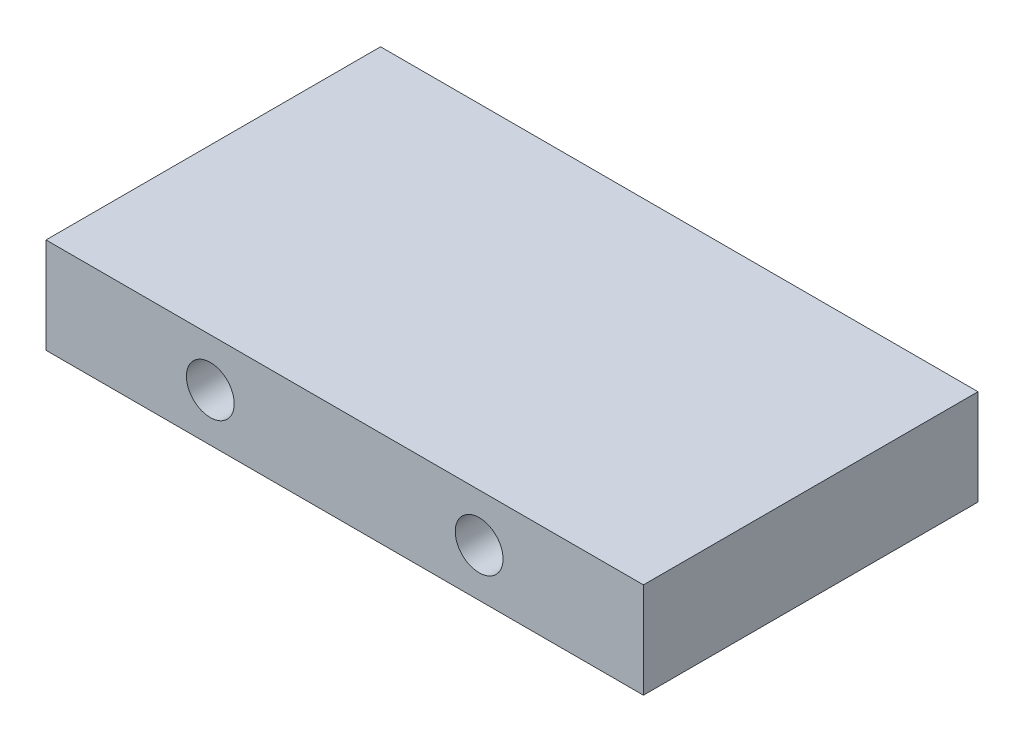
ISO-10303-21;
HEADER;
FILE_DESCRIPTION(('STEP AP214'),'2;1');
FILE_NAME('part.step','',(''),(''),'','','');
FILE_SCHEMA(('AUTOMOTIVE_DESIGN { 1 0 10303 214 1 1 1 1 }'));
ENDSEC;
DATA;
#1=APPLICATION_CONTEXT('core data for automotive mechanical design processes');
#2=APPLICATION_PROTOCOL_DEFINITION('international standard','automotive_design',2000,#1);
#3=PRODUCT_CONTEXT('',#1,'mechanical');
#4=PRODUCT('Part','Part','',(#3));
#5=PRODUCT_RELATED_PRODUCT_CATEGORY('part','',(#4));
#6=PRODUCT_DEFINITION_FORMATION('','',#4);
#7=PRODUCT_DEFINITION_CONTEXT('part definition',#1,'design');
#8=PRODUCT_DEFINITION('design','',#6,#7);
#9=PRODUCT_DEFINITION_SHAPE('','',#8);
#10=(LENGTH_UNIT() NAMED_UNIT(*) SI_UNIT(.MILLI.,.METRE.));
#11=(NAMED_UNIT(*) PLANE_ANGLE_UNIT() SI_UNIT($,.RADIAN.));
#12=(NAMED_UNIT(*) SI_UNIT($,.STERADIAN.) SOLID_ANGLE_UNIT());
#13=UNCERTAINTY_MEASURE_WITH_UNIT(LENGTH_MEASURE(1.E-05),#10,'distance_accuracy_value','');
#14=(GEOMETRIC_REPRESENTATION_CONTEXT(3) GLOBAL_UNCERTAINTY_ASSIGNED_CONTEXT((#13)) GLOBAL_UNIT_ASSIGNED_CONTEXT((#10,
#11,#12)) REPRESENTATION_CONTEXT('',''));
#15=CARTESIAN_POINT('',(0.,0.,0.));
#16=DIRECTION('',(0.,0.,1.));
#17=DIRECTION('',(1.,0.,0.));
#18=AXIS2_PLACEMENT_3D('',#15,#16,#17);
#19=CARTESIAN_POINT('',(0.,0.,28.));
#20=DIRECTION('',(0.,0.,-1.));
#21=DIRECTION('',(-1.,0.,0.));
#22=AXIS2_PLACEMENT_3D('',#19,#20,#21);
#23=PLANE('',#22);
#24=DIRECTION('',(0.,-1.,0.));
#25=VECTOR('',#24,1.);
#26=CARTESIAN_POINT('',(-25.,4.,28.));
#27=LINE('',#26,#25);
#28=CARTESIAN_POINT('',(-25.,4.,28.));
#29=VERTEX_POINT('',#28);
#30=CARTESIAN_POINT('',(-25.,-4.,28.));
#31=VERTEX_POINT('',#30);
#32=EDGE_CURVE('E85',#29,#31,#27,.T.);
#33=ORIENTED_EDGE('',*,*,#32,.T.);
#34=DIRECTION('',(1.,0.,0.));
#35=VECTOR('',#34,1.);
#36=CARTESIAN_POINT('',(25.,-4.,28.));
#37=LINE('',#36,#35);
#38=CARTESIAN_POINT('',(25.,-4.,28.));
#39=VERTEX_POINT('',#38);
#40=EDGE_CURVE('E80',#31,#39,#37,.T.);
#41=ORIENTED_EDGE('',*,*,#40,.T.);
#42=DIRECTION('',(0.,1.,0.));
#43=VECTOR('',#42,1.);
#44=CARTESIAN_POINT('',(25.,4.,28.));
#45=LINE('',#44,#43);
#46=CARTESIAN_POINT('',(25.,4.,28.));
#47=VERTEX_POINT('',#46);
#48=EDGE_CURVE('E83',#39,#47,#45,.T.);
#49=ORIENTED_EDGE('',*,*,#48,.T.);
#50=DIRECTION('',(-1.,0.,0.));
#51=VECTOR('',#50,1.);
#52=CARTESIAN_POINT('',(25.,4.,28.));
#53=LINE('',#52,#51);
#54=EDGE_CURVE('E50',#47,#29,#53,.T.);
#55=ORIENTED_EDGE('',*,*,#54,.T.);
#56=EDGE_LOOP('',(#33,#41,#49,#55));
#57=FACE_BOUND('',#56,.T.);
#58=CARTESIAN_POINT('',(-11.25,0.,28.));
#59=DIRECTION('',(0.,0.,1.));
#60=DIRECTION('',(1.,0.,0.));
#61=AXIS2_PLACEMENT_3D('',#58,#59,#60);
#62=CIRCLE('',#61,2.);
#63=CARTESIAN_POINT('',(-9.25,0.,28.));
#64=VERTEX_POINT('',#63);
#65=EDGE_CURVE('E100',#64,#64,#62,.T.);
#66=ORIENTED_EDGE('',*,*,#65,.F.);
#67=EDGE_LOOP('',(#66));
#68=FACE_BOUND('',#67,.T.);
#69=CARTESIAN_POINT('',(11.25,0.,28.));
#70=DIRECTION('',(0.,0.,1.));
#71=DIRECTION('',(1.,0.,0.));
#72=AXIS2_PLACEMENT_3D('',#69,#70,#71);
#73=CIRCLE('',#72,2.);
#74=CARTESIAN_POINT('',(13.25,0.,28.));
#75=VERTEX_POINT('',#74);
#76=EDGE_CURVE('E115',#75,#75,#73,.T.);
#77=ORIENTED_EDGE('',*,*,#76,.F.);
#78=EDGE_LOOP('',(#77));
#79=FACE_BOUND('',#78,.T.);
#80=ADVANCED_FACE('F33',(#57,#68,#79),#23,.F.);
#81=CARTESIAN_POINT('',(0.,0.,0.));
#82=DIRECTION('',(0.,0.,-1.));
#83=DIRECTION('',(-1.,0.,0.));
#84=AXIS2_PLACEMENT_3D('',#81,#82,#83);
#85=PLANE('',#84);
#86=CARTESIAN_POINT('',(-11.25,0.,0.));
#87=DIRECTION('',(0.,0.,1.));
#88=DIRECTION('',(1.,0.,0.));
#89=AXIS2_PLACEMENT_3D('',#86,#87,#88);
#90=CIRCLE('',#89,2.);
#91=CARTESIAN_POINT('',(-9.25,0.,0.));
#92=VERTEX_POINT('',#91);
#93=EDGE_CURVE('E112',#92,#92,#90,.T.);
#94=ORIENTED_EDGE('',*,*,#93,.T.);
#95=EDGE_LOOP('',(#94));
#96=FACE_BOUND('',#95,.T.);
#97=DIRECTION('',(0.,-1.,0.));
#98=VECTOR('',#97,1.);
#99=CARTESIAN_POINT('',(-25.,4.,0.));
#100=LINE('',#99,#98);
#101=CARTESIAN_POINT('',(-25.,4.,0.));
#102=VERTEX_POINT('',#101);
#103=CARTESIAN_POINT('',(-25.,-4.,0.));
#104=VERTEX_POINT('',#103);
#105=EDGE_CURVE('E97',#102,#104,#100,.T.);
#106=ORIENTED_EDGE('',*,*,#105,.F.);
#107=DIRECTION('',(-1.,0.,0.));
#108=VECTOR('',#107,1.);
#109=CARTESIAN_POINT('',(25.,4.,0.));
#110=LINE('',#109,#108);
#111=CARTESIAN_POINT('',(25.,4.,0.));
#112=VERTEX_POINT('',#111);
#113=EDGE_CURVE('E73',#112,#102,#110,.T.);
#114=ORIENTED_EDGE('',*,*,#113,.F.);
#115=DIRECTION('',(0.,1.,0.));
#116=VECTOR('',#115,1.);
#117=CARTESIAN_POINT('',(25.,4.,0.));
#118=LINE('',#117,#116);
#119=CARTESIAN_POINT('',(25.,-4.,0.));
#120=VERTEX_POINT('',#119);
#121=EDGE_CURVE('E67',#120,#112,#118,.T.);
#122=ORIENTED_EDGE('',*,*,#121,.F.);
#123=DIRECTION('',(1.,0.,0.));
#124=VECTOR('',#123,1.);
#125=CARTESIAN_POINT('',(25.,-4.,0.));
#126=LINE('',#125,#124);
#127=EDGE_CURVE('E89',#104,#120,#126,.T.);
#128=ORIENTED_EDGE('',*,*,#127,.F.);
#129=EDGE_LOOP('',(#106,#114,#122,#128));
#130=FACE_BOUND('',#129,.T.);
#131=CARTESIAN_POINT('',(11.25,0.,0.));
#132=DIRECTION('',(0.,0.,1.));
#133=DIRECTION('',(1.,0.,0.));
#134=AXIS2_PLACEMENT_3D('',#131,#132,#133);
#135=CIRCLE('',#134,2.);
#136=CARTESIAN_POINT('',(13.25,0.,0.));
#137=VERTEX_POINT('',#136);
#138=EDGE_CURVE('E118',#137,#137,#135,.T.);
#139=ORIENTED_EDGE('',*,*,#138,.T.);
#140=EDGE_LOOP('',(#139));
#141=FACE_BOUND('',#140,.T.);
#142=ADVANCED_FACE('F108',(#96,#130,#141),#85,.T.);
#143=CARTESIAN_POINT('',(-25.,4.,28.));
#144=DIRECTION('',(1.,0.,0.));
#145=DIRECTION('',(0.,0.,-1.));
#146=AXIS2_PLACEMENT_3D('',#143,#144,#145);
#147=PLANE('',#146);
#148=ORIENTED_EDGE('',*,*,#105,.T.);
#149=DIRECTION('',(0.,0.,-1.));
#150=VECTOR('',#149,1.);
#151=CARTESIAN_POINT('',(-25.,-4.,28.));
#152=LINE('',#151,#150);
#153=EDGE_CURVE('E11',#31,#104,#152,.T.);
#154=ORIENTED_EDGE('',*,*,#153,.F.);
#155=ORIENTED_EDGE('',*,*,#32,.F.);
#156=DIRECTION('',(0.,0.,-1.));
#157=VECTOR('',#156,1.);
#158=CARTESIAN_POINT('',(-25.,4.,28.));
#159=LINE('',#158,#157);
#160=EDGE_CURVE('E93',#29,#102,#159,.T.);
#161=ORIENTED_EDGE('',*,*,#160,.T.);
#162=EDGE_LOOP('',(#148,#154,#155,#161));
#163=FACE_BOUND('',#162,.T.);
#164=ADVANCED_FACE('F35',(#163),#147,.F.);
#165=CARTESIAN_POINT('',(25.,-4.,28.));
#166=DIRECTION('',(0.,1.,0.));
#167=DIRECTION('',(-1.,0.,0.));
#168=AXIS2_PLACEMENT_3D('',#165,#166,#167);
#169=PLANE('',#168);
#170=ORIENTED_EDGE('',*,*,#127,.T.);
#171=DIRECTION('',(0.,0.,-1.));
#172=VECTOR('',#171,1.);
#173=CARTESIAN_POINT('',(25.,-4.,28.));
#174=LINE('',#173,#172);
#175=EDGE_CURVE('E42',#39,#120,#174,.T.);
#176=ORIENTED_EDGE('',*,*,#175,.F.);
#177=ORIENTED_EDGE('',*,*,#40,.F.);
#178=ORIENTED_EDGE('',*,*,#153,.T.);
#179=EDGE_LOOP('',(#170,#176,#177,#178));
#180=FACE_BOUND('',#179,.T.);
#181=ADVANCED_FACE('F88',(#180),#169,.F.);
#182=CARTESIAN_POINT('',(25.,4.,28.));
#183=DIRECTION('',(-1.,0.,0.));
#184=DIRECTION('',(0.,0.,1.));
#185=AXIS2_PLACEMENT_3D('',#182,#183,#184);
#186=PLANE('',#185);
#187=ORIENTED_EDGE('',*,*,#121,.T.);
#188=DIRECTION('',(0.,0.,-1.));
#189=VECTOR('',#188,1.);
#190=CARTESIAN_POINT('',(25.,4.,28.));
#191=LINE('',#190,#189);
#192=EDGE_CURVE('E90',#47,#112,#191,.T.);
#193=ORIENTED_EDGE('',*,*,#192,.F.);
#194=ORIENTED_EDGE('',*,*,#48,.F.);
#195=ORIENTED_EDGE('',*,*,#175,.T.);
#196=EDGE_LOOP('',(#187,#193,#194,#195));
#197=FACE_BOUND('',#196,.T.);
#198=ADVANCED_FACE('F91',(#197),#186,.F.);
#199=CARTESIAN_POINT('',(25.,4.,28.));
#200=DIRECTION('',(0.,-1.,0.));
#201=DIRECTION('',(1.,0.,0.));
#202=AXIS2_PLACEMENT_3D('',#199,#200,#201);
#203=PLANE('',#202);
#204=ORIENTED_EDGE('',*,*,#113,.T.);
#205=ORIENTED_EDGE('',*,*,#160,.F.);
#206=ORIENTED_EDGE('',*,*,#54,.F.);
#207=ORIENTED_EDGE('',*,*,#192,.T.);
#208=EDGE_LOOP('',(#204,#205,#206,#207));
#209=FACE_BOUND('',#208,.T.);
#210=ADVANCED_FACE('F105',(#209),#203,.F.);
#211=CARTESIAN_POINT('',(-11.25,0.,28.));
#212=DIRECTION('',(0.,0.,-1.));
#213=DIRECTION('',(-1.,0.,0.));
#214=AXIS2_PLACEMENT_3D('',#211,#212,#213);
#215=CYLINDRICAL_SURFACE('',#214,2.);
#216=ORIENTED_EDGE('',*,*,#65,.T.);
#217=EDGE_LOOP('',(#216));
#218=FACE_BOUND('',#217,.T.);
#219=ORIENTED_EDGE('',*,*,#93,.F.);
#220=EDGE_LOOP('',(#219));
#221=FACE_BOUND('',#220,.T.);
#222=ADVANCED_FACE('F135',(#218,#221),#215,.F.);
#223=CARTESIAN_POINT('',(11.25,0.,28.));
#224=DIRECTION('',(0.,0.,-1.));
#225=DIRECTION('',(-1.,0.,0.));
#226=AXIS2_PLACEMENT_3D('',#223,#224,#225);
#227=CYLINDRICAL_SURFACE('',#226,2.);
#228=ORIENTED_EDGE('',*,*,#76,.T.);
#229=EDGE_LOOP('',(#228));
#230=FACE_BOUND('',#229,.T.);
#231=ORIENTED_EDGE('',*,*,#138,.F.);
#232=EDGE_LOOP('',(#231));
#233=FACE_BOUND('',#232,.T.);
#234=ADVANCED_FACE('F124',(#230,#233),#227,.F.);
#235=CLOSED_SHELL('',(#80,#142,#164,#181,#198,#210,#222,#234));
#236=MANIFOLD_SOLID_BREP('B2',#235);
#237=ADVANCED_BREP_SHAPE_REPRESENTATION('',(#18,#236),#14);
#238=SHAPE_DEFINITION_REPRESENTATION(#9,#237);
ENDSEC;
END-ISO-10303-21;
